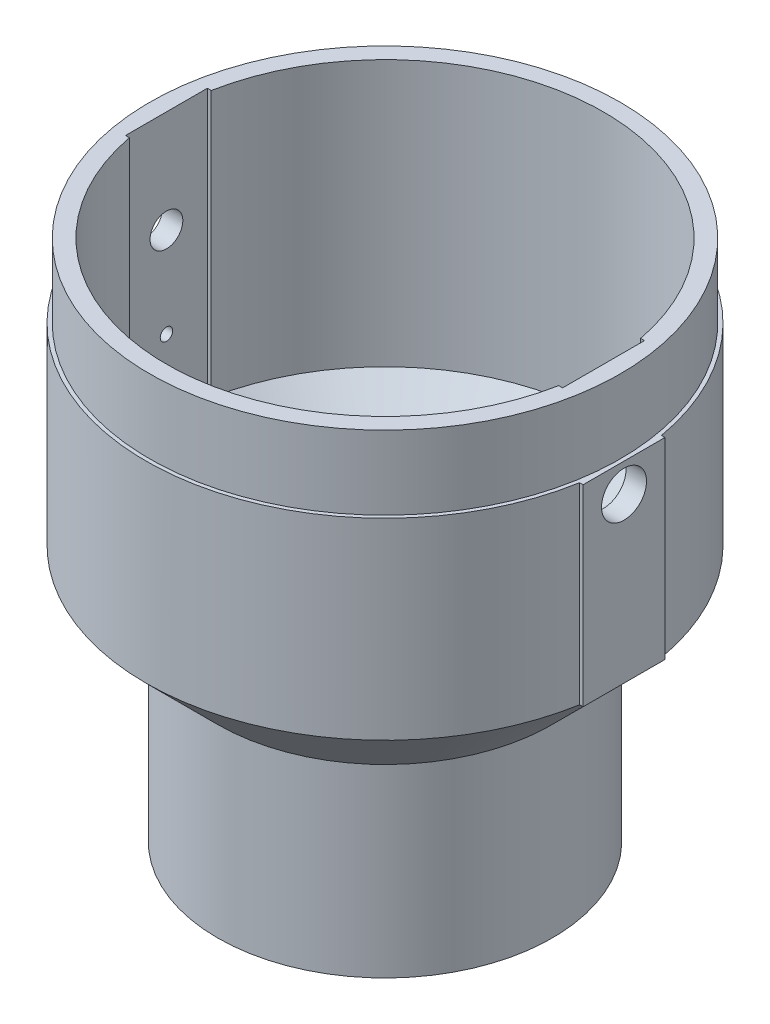
ISO-10303-21;
HEADER;
FILE_DESCRIPTION(('STEP AP214'),'2;1');
FILE_NAME('part.step','',(''),(''),'','','');
FILE_SCHEMA(('AUTOMOTIVE_DESIGN { 1 0 10303 214 1 1 1 1 }'));
ENDSEC;
DATA;
#1=APPLICATION_CONTEXT('core data for automotive mechanical design processes');
#2=APPLICATION_PROTOCOL_DEFINITION('international standard','automotive_design',2000,#1);
#3=PRODUCT_CONTEXT('',#1,'mechanical');
#4=PRODUCT('Part','Part','',(#3));
#5=PRODUCT_RELATED_PRODUCT_CATEGORY('part','',(#4));
#6=PRODUCT_DEFINITION_FORMATION('','',#4);
#7=PRODUCT_DEFINITION_CONTEXT('part definition',#1,'design');
#8=PRODUCT_DEFINITION('design','',#6,#7);
#9=PRODUCT_DEFINITION_SHAPE('','',#8);
#10=(LENGTH_UNIT() NAMED_UNIT(*) SI_UNIT(.MILLI.,.METRE.));
#11=(NAMED_UNIT(*) PLANE_ANGLE_UNIT() SI_UNIT($,.RADIAN.));
#12=(NAMED_UNIT(*) SI_UNIT($,.STERADIAN.) SOLID_ANGLE_UNIT());
#13=UNCERTAINTY_MEASURE_WITH_UNIT(LENGTH_MEASURE(1.E-05),#10,'distance_accuracy_value','');
#14=(GEOMETRIC_REPRESENTATION_CONTEXT(3) GLOBAL_UNCERTAINTY_ASSIGNED_CONTEXT((#13)) GLOBAL_UNIT_ASSIGNED_CONTEXT((#10,
#11,#12)) REPRESENTATION_CONTEXT('',''));
#15=CARTESIAN_POINT('',(0.,0.,0.));
#16=DIRECTION('',(0.,0.,1.));
#17=DIRECTION('',(1.,0.,0.));
#18=AXIS2_PLACEMENT_3D('',#15,#16,#17);
#19=CARTESIAN_POINT('',(0.,0.,0.));
#20=DIRECTION('',(0.,1.,0.));
#21=DIRECTION('',(0.,0.,1.));
#22=AXIS2_PLACEMENT_3D('',#19,#20,#21);
#23=CYLINDRICAL_SURFACE('',#22,53.41);
#24=DIRECTION('',(0.,1.,0.));
#25=VECTOR('',#24,1.);
#26=CARTESIAN_POINT('',(52.4654943748746,0.,-10.));
#27=LINE('',#26,#25);
#28=CARTESIAN_POINT('',(52.4654943748746,-65.,-10.));
#29=VERTEX_POINT('',#28);
#30=CARTESIAN_POINT('',(52.4654943748746,0.,-10.));
#31=VERTEX_POINT('',#30);
#32=EDGE_CURVE('E195',#29,#31,#27,.T.);
#33=ORIENTED_EDGE('',*,*,#32,.T.);
#34=CARTESIAN_POINT('',(0.,0.,0.));
#35=DIRECTION('',(0.,1.,0.));
#36=DIRECTION('',(0.,0.,1.));
#37=AXIS2_PLACEMENT_3D('',#34,#35,#36);
#38=CIRCLE('',#37,53.41);
#39=CARTESIAN_POINT('',(-52.4654943748746,0.,-10.));
#40=VERTEX_POINT('',#39);
#41=EDGE_CURVE('E200',#31,#40,#38,.T.);
#42=ORIENTED_EDGE('',*,*,#41,.T.);
#43=DIRECTION('',(0.,1.,0.));
#44=VECTOR('',#43,1.);
#45=CARTESIAN_POINT('',(-52.4654943748746,0.,-10.));
#46=LINE('',#45,#44);
#47=CARTESIAN_POINT('',(-52.4654943748746,-65.,-10.));
#48=VERTEX_POINT('',#47);
#49=EDGE_CURVE('E299',#40,#48,#46,.F.);
#50=ORIENTED_EDGE('',*,*,#49,.T.);
#51=CARTESIAN_POINT('',(0.,-65.,0.));
#52=DIRECTION('',(0.,1.,0.));
#53=DIRECTION('',(0.,0.,1.));
#54=AXIS2_PLACEMENT_3D('',#51,#52,#53);
#55=CIRCLE('',#54,53.41);
#56=EDGE_CURVE('E374',#29,#48,#55,.T.);
#57=ORIENTED_EDGE('',*,*,#56,.F.);
#58=EDGE_LOOP('',(#33,#42,#50,#57));
#59=FACE_BOUND('',#58,.T.);
#60=ADVANCED_FACE('F45',(#59),#23,.F.);
#61=DIRECTION('',(0.,1.,0.));
#62=VECTOR('',#61,1.);
#63=CARTESIAN_POINT('',(52.4654943748746,0.,10.));
#64=LINE('',#63,#62);
#65=CARTESIAN_POINT('',(52.4654943748746,0.,10.));
#66=VERTEX_POINT('',#65);
#67=CARTESIAN_POINT('',(52.4654943748746,-65.,10.));
#68=VERTEX_POINT('',#67);
#69=EDGE_CURVE('E215',#66,#68,#64,.F.);
#70=ORIENTED_EDGE('',*,*,#69,.T.);
#71=CARTESIAN_POINT('',(-52.4654943748746,-65.,10.));
#72=VERTEX_POINT('',#71);
#73=EDGE_CURVE('E380',#72,#68,#55,.T.);
#74=ORIENTED_EDGE('',*,*,#73,.F.);
#75=DIRECTION('',(0.,1.,0.));
#76=VECTOR('',#75,1.);
#77=CARTESIAN_POINT('',(-52.4654943748746,0.,10.));
#78=LINE('',#77,#76);
#79=CARTESIAN_POINT('',(-52.4654943748746,0.,10.));
#80=VERTEX_POINT('',#79);
#81=EDGE_CURVE('E279',#72,#80,#78,.T.);
#82=ORIENTED_EDGE('',*,*,#81,.T.);
#83=EDGE_CURVE('E370',#80,#66,#38,.T.);
#84=ORIENTED_EDGE('',*,*,#83,.T.);
#85=EDGE_LOOP('',(#70,#74,#82,#84));
#86=FACE_BOUND('',#85,.T.);
#87=ADVANCED_FACE('F456',(#86),#23,.F.);
#88=CARTESIAN_POINT('',(0.,0.,0.));
#89=DIRECTION('',(0.,1.,0.));
#90=DIRECTION('',(0.,0.,1.));
#91=AXIS2_PLACEMENT_3D('',#88,#89,#90);
#92=CYLINDRICAL_SURFACE('',#91,58.41);
#93=CARTESIAN_POINT('',(0.,-18.,0.));
#94=DIRECTION('',(0.,-1.,0.));
#95=DIRECTION('',(0.,0.,-1.));
#96=AXIS2_PLACEMENT_3D('',#93,#94,#95);
#97=CIRCLE('',#96,58.41);
#98=CARTESIAN_POINT('',(-57.547615936718,-18.,-10.));
#99=VERTEX_POINT('',#98);
#100=CARTESIAN_POINT('',(57.547615936718,-18.,-10.));
#101=VERTEX_POINT('',#100);
#102=EDGE_CURVE('E359',#99,#101,#97,.T.);
#103=ORIENTED_EDGE('',*,*,#102,.T.);
#104=DIRECTION('',(0.,1.,0.));
#105=VECTOR('',#104,1.);
#106=CARTESIAN_POINT('',(57.547615936718,0.,-10.));
#107=LINE('',#106,#105);
#108=CARTESIAN_POINT('',(57.547615936718,-65.,-10.));
#109=VERTEX_POINT('',#108);
#110=EDGE_CURVE('E70',#109,#101,#107,.T.);
#111=ORIENTED_EDGE('',*,*,#110,.F.);
#112=CARTESIAN_POINT('',(0.,-65.,0.));
#113=DIRECTION('',(0.,1.,0.));
#114=DIRECTION('',(0.,0.,1.));
#115=AXIS2_PLACEMENT_3D('',#112,#113,#114);
#116=CIRCLE('',#115,58.41);
#117=CARTESIAN_POINT('',(-57.547615936718,-65.,-10.));
#118=VERTEX_POINT('',#117);
#119=EDGE_CURVE('E55',#109,#118,#116,.T.);
#120=ORIENTED_EDGE('',*,*,#119,.T.);
#121=DIRECTION('',(0.,1.,0.));
#122=VECTOR('',#121,1.);
#123=CARTESIAN_POINT('',(-57.547615936718,0.,-10.));
#124=LINE('',#123,#122);
#125=EDGE_CURVE('E337',#99,#118,#124,.F.);
#126=ORIENTED_EDGE('',*,*,#125,.F.);
#127=EDGE_LOOP('',(#103,#111,#120,#126));
#128=FACE_BOUND('',#127,.T.);
#129=ADVANCED_FACE('F429',(#128),#92,.T.);
#130=CARTESIAN_POINT('',(-57.547615936718,-65.,10.));
#131=VERTEX_POINT('',#130);
#132=CARTESIAN_POINT('',(57.547615936718,-65.,10.));
#133=VERTEX_POINT('',#132);
#134=EDGE_CURVE('E54',#131,#133,#116,.T.);
#135=ORIENTED_EDGE('',*,*,#134,.T.);
#136=DIRECTION('',(0.,1.,0.));
#137=VECTOR('',#136,1.);
#138=CARTESIAN_POINT('',(57.547615936718,0.,10.));
#139=LINE('',#138,#137);
#140=CARTESIAN_POINT('',(57.547615936718,-18.,10.));
#141=VERTEX_POINT('',#140);
#142=EDGE_CURVE('E246',#141,#133,#139,.F.);
#143=ORIENTED_EDGE('',*,*,#142,.F.);
#144=CARTESIAN_POINT('',(-57.547615936718,-18.,10.));
#145=VERTEX_POINT('',#144);
#146=EDGE_CURVE('E341',#141,#145,#97,.T.);
#147=ORIENTED_EDGE('',*,*,#146,.T.);
#148=DIRECTION('',(0.,1.,0.));
#149=VECTOR('',#148,1.);
#150=CARTESIAN_POINT('',(-57.547615936718,0.,10.));
#151=LINE('',#150,#149);
#152=EDGE_CURVE('E322',#131,#145,#151,.T.);
#153=ORIENTED_EDGE('',*,*,#152,.F.);
#154=EDGE_LOOP('',(#135,#143,#147,#153));
#155=FACE_BOUND('',#154,.T.);
#156=ADVANCED_FACE('F405',(#155),#92,.T.);
#157=CARTESIAN_POINT('',(53.41,0.,0.));
#158=DIRECTION('',(0.,-1.,0.));
#159=DIRECTION('',(0.,0.,-1.));
#160=AXIS2_PLACEMENT_3D('',#157,#158,#159);
#161=PLANE('',#160);
#162=DIRECTION('',(1.,0.,0.));
#163=VECTOR('',#162,1.);
#164=CARTESIAN_POINT('',(-58.411,0.,-10.));
#165=LINE('',#164,#163);
#166=CARTESIAN_POINT('',(53.41,0.,-10.));
#167=VERTEX_POINT('',#166);
#168=EDGE_CURVE('E190',#31,#167,#165,.T.);
#169=ORIENTED_EDGE('',*,*,#168,.T.);
#170=DIRECTION('',(0.,0.,-1.));
#171=VECTOR('',#170,1.);
#172=CARTESIAN_POINT('',(53.41,0.,10.));
#173=LINE('',#172,#171);
#174=CARTESIAN_POINT('',(53.41,0.,10.));
#175=VERTEX_POINT('',#174);
#176=EDGE_CURVE('E173',#175,#167,#173,.T.);
#177=ORIENTED_EDGE('',*,*,#176,.F.);
#178=DIRECTION('',(1.,0.,0.));
#179=VECTOR('',#178,1.);
#180=CARTESIAN_POINT('',(-58.411,0.,10.));
#181=LINE('',#180,#179);
#182=EDGE_CURVE('E184',#66,#175,#181,.T.);
#183=ORIENTED_EDGE('',*,*,#182,.F.);
#184=ORIENTED_EDGE('',*,*,#83,.F.);
#185=DIRECTION('',(-1.,0.,0.));
#186=VECTOR('',#185,1.);
#187=CARTESIAN_POINT('',(58.411,0.,10.));
#188=LINE('',#187,#186);
#189=CARTESIAN_POINT('',(-53.41,0.,10.));
#190=VERTEX_POINT('',#189);
#191=EDGE_CURVE('E280',#80,#190,#188,.T.);
#192=ORIENTED_EDGE('',*,*,#191,.T.);
#193=DIRECTION('',(0.,0.,1.));
#194=VECTOR('',#193,1.);
#195=CARTESIAN_POINT('',(-53.41,0.,-10.));
#196=LINE('',#195,#194);
#197=CARTESIAN_POINT('',(-53.41,0.,-10.));
#198=VERTEX_POINT('',#197);
#199=EDGE_CURVE('E304',#198,#190,#196,.T.);
#200=ORIENTED_EDGE('',*,*,#199,.F.);
#201=DIRECTION('',(-1.,0.,0.));
#202=VECTOR('',#201,1.);
#203=CARTESIAN_POINT('',(58.411,0.,-10.));
#204=LINE('',#203,#202);
#205=EDGE_CURVE('E303',#40,#198,#204,.T.);
#206=ORIENTED_EDGE('',*,*,#205,.F.);
#207=ORIENTED_EDGE('',*,*,#41,.F.);
#208=EDGE_LOOP('',(#169,#177,#183,#184,#192,#200,#206,#207));
#209=FACE_BOUND('',#208,.T.);
#210=CARTESIAN_POINT('',(0.,0.,0.));
#211=DIRECTION('',(0.,-1.,0.));
#212=DIRECTION('',(0.,0.,-1.));
#213=AXIS2_PLACEMENT_3D('',#210,#211,#212);
#214=CIRCLE('',#213,57.5);
#215=CARTESIAN_POINT('',(0.,0.,-57.5));
#216=VERTEX_POINT('',#215);
#217=EDGE_CURVE('E366',#216,#216,#214,.T.);
#218=ORIENTED_EDGE('',*,*,#217,.F.);
#219=EDGE_LOOP('',(#218));
#220=FACE_BOUND('',#219,.T.);
#221=ADVANCED_FACE('F47',(#209,#220),#161,.F.);
#222=CARTESIAN_POINT('',(0.,-82.4999999999999,0.));
#223=DIRECTION('',(0.,1.,0.));
#224=DIRECTION('',(0.,0.,1.));
#225=AXIS2_PLACEMENT_3D('',#222,#223,#224);
#226=CONICAL_SURFACE('',#225,40.91,0.785398163397452);
#227=CARTESIAN_POINT('',(-58.41,-65.,0.));
#228=VERTEX_POINT('',#227);
#229=EDGE_CURVE('E11',#118,#228,#116,.T.);
#230=ORIENTED_EDGE('',*,*,#229,.F.);
#231=ORIENTED_EDGE('',*,*,#119,.F.);
#232=CARTESIAN_POINT('',(0.,-65.,0.));
#233=DIRECTION('',(0.,-1.,0.));
#234=DIRECTION('',(0.,0.,-1.));
#235=AXIS2_PLACEMENT_3D('',#232,#233,#234);
#236=CIRCLE('',#235,58.41);
#237=CARTESIAN_POINT('',(58.41,-65.,0.));
#238=VERTEX_POINT('',#237);
#239=EDGE_CURVE('E228',#238,#109,#236,.F.);
#240=ORIENTED_EDGE('',*,*,#239,.F.);
#241=CARTESIAN_POINT('',(0.,-65.,0.));
#242=DIRECTION('',(0.,-1.,0.));
#243=DIRECTION('',(0.,0.,-1.));
#244=AXIS2_PLACEMENT_3D('',#241,#242,#243);
#245=CIRCLE('',#244,58.41);
#246=EDGE_CURVE('E250',#133,#238,#245,.F.);
#247=ORIENTED_EDGE('',*,*,#246,.F.);
#248=ORIENTED_EDGE('',*,*,#134,.F.);
#249=CARTESIAN_POINT('',(0.,-65.,0.));
#250=DIRECTION('',(0.,-1.,0.));
#251=DIRECTION('',(0.,0.,-1.));
#252=AXIS2_PLACEMENT_3D('',#249,#250,#251);
#253=CIRCLE('',#252,58.41);
#254=EDGE_CURVE('E318',#228,#131,#253,.F.);
#255=ORIENTED_EDGE('',*,*,#254,.F.);
#256=EDGE_LOOP('',(#230,#231,#240,#247,#248,#255));
#257=FACE_BOUND('',#256,.T.);
#258=CARTESIAN_POINT('',(0.,-82.4999999999999,0.));
#259=DIRECTION('',(0.,1.,0.));
#260=DIRECTION('',(0.,0.,1.));
#261=AXIS2_PLACEMENT_3D('',#258,#259,#260);
#262=CIRCLE('',#261,40.91);
#263=CARTESIAN_POINT('',(0.,-82.4999999999999,40.91));
#264=VERTEX_POINT('',#263);
#265=EDGE_CURVE('E391',#264,#264,#262,.T.);
#266=ORIENTED_EDGE('',*,*,#265,.T.);
#267=EDGE_LOOP('',(#266));
#268=FACE_BOUND('',#267,.T.);
#269=ADVANCED_FACE('F443',(#257,#268),#226,.T.);
#270=CARTESIAN_POINT('',(0.,0.,0.));
#271=DIRECTION('',(0.,1.,0.));
#272=DIRECTION('',(0.,0.,1.));
#273=AXIS2_PLACEMENT_3D('',#270,#271,#272);
#274=CYLINDRICAL_SURFACE('',#273,40.91);
#275=ORIENTED_EDGE('',*,*,#265,.F.);
#276=EDGE_LOOP('',(#275));
#277=FACE_BOUND('',#276,.T.);
#278=CARTESIAN_POINT('',(0.,-127.679491924311,0.));
#279=DIRECTION('',(0.,1.,0.));
#280=DIRECTION('',(0.,0.,1.));
#281=AXIS2_PLACEMENT_3D('',#278,#279,#280);
#282=CIRCLE('',#281,40.91);
#283=CARTESIAN_POINT('',(0.,-127.679491924311,40.91));
#284=VERTEX_POINT('',#283);
#285=EDGE_CURVE('E388',#284,#284,#282,.T.);
#286=ORIENTED_EDGE('',*,*,#285,.T.);
#287=EDGE_LOOP('',(#286));
#288=FACE_BOUND('',#287,.T.);
#289=ADVANCED_FACE('F478',(#277,#288),#274,.T.);
#290=CARTESIAN_POINT('',(35.91,-127.679491924311,0.));
#291=DIRECTION('',(0.,1.,0.));
#292=DIRECTION('',(0.,0.,1.));
#293=AXIS2_PLACEMENT_3D('',#290,#291,#292);
#294=PLANE('',#293);
#295=ORIENTED_EDGE('',*,*,#285,.F.);
#296=EDGE_LOOP('',(#295));
#297=FACE_BOUND('',#296,.T.);
#298=CARTESIAN_POINT('',(0.,-127.679491924311,0.));
#299=DIRECTION('',(0.,1.,0.));
#300=DIRECTION('',(0.,0.,1.));
#301=AXIS2_PLACEMENT_3D('',#298,#299,#300);
#302=CIRCLE('',#301,35.91);
#303=CARTESIAN_POINT('',(0.,-127.679491924311,35.91));
#304=VERTEX_POINT('',#303);
#305=EDGE_CURVE('E384',#304,#304,#302,.T.);
#306=ORIENTED_EDGE('',*,*,#305,.T.);
#307=EDGE_LOOP('',(#306));
#308=FACE_BOUND('',#307,.T.);
#309=ADVANCED_FACE('F474',(#297,#308),#294,.F.);
#310=CARTESIAN_POINT('',(0.,0.,0.));
#311=DIRECTION('',(0.,1.,0.));
#312=DIRECTION('',(0.,0.,1.));
#313=AXIS2_PLACEMENT_3D('',#310,#311,#312);
#314=CYLINDRICAL_SURFACE('',#313,35.91);
#315=ORIENTED_EDGE('',*,*,#305,.F.);
#316=EDGE_LOOP('',(#315));
#317=FACE_BOUND('',#316,.T.);
#318=CARTESIAN_POINT('',(0.,-82.4999999999999,0.));
#319=DIRECTION('',(0.,1.,0.));
#320=DIRECTION('',(0.,0.,1.));
#321=AXIS2_PLACEMENT_3D('',#318,#319,#320);
#322=CIRCLE('',#321,35.91);
#323=CARTESIAN_POINT('',(0.,-82.4999999999999,35.91));
#324=VERTEX_POINT('',#323);
#325=EDGE_CURVE('E379',#324,#324,#322,.T.);
#326=ORIENTED_EDGE('',*,*,#325,.T.);
#327=EDGE_LOOP('',(#326));
#328=FACE_BOUND('',#327,.T.);
#329=ADVANCED_FACE('F470',(#317,#328),#314,.F.);
#330=CARTESIAN_POINT('',(0.,-65.,0.));
#331=DIRECTION('',(0.,1.,0.));
#332=DIRECTION('',(0.,0.,1.));
#333=AXIS2_PLACEMENT_3D('',#330,#331,#332);
#334=CONICAL_SURFACE('',#333,53.41,0.785398163397451);
#335=ORIENTED_EDGE('',*,*,#325,.F.);
#336=EDGE_LOOP('',(#335));
#337=FACE_BOUND('',#336,.T.);
#338=CARTESIAN_POINT('',(-53.41,-65.,0.));
#339=VERTEX_POINT('',#338);
#340=EDGE_CURVE('E375',#48,#339,#55,.T.);
#341=ORIENTED_EDGE('',*,*,#340,.T.);
#342=CARTESIAN_POINT('',(0.,-65.,0.));
#343=DIRECTION('',(0.,1.,0.));
#344=DIRECTION('',(0.,0.,1.));
#345=AXIS2_PLACEMENT_3D('',#342,#343,#344);
#346=CIRCLE('',#345,53.41);
#347=EDGE_CURVE('E271',#339,#72,#346,.T.);
#348=ORIENTED_EDGE('',*,*,#347,.T.);
#349=ORIENTED_EDGE('',*,*,#73,.T.);
#350=CARTESIAN_POINT('',(0.,-65.,0.));
#351=DIRECTION('',(0.,1.,0.));
#352=DIRECTION('',(0.,0.,1.));
#353=AXIS2_PLACEMENT_3D('',#350,#351,#352);
#354=CIRCLE('',#353,53.41);
#355=CARTESIAN_POINT('',(53.41,-65.,0.));
#356=VERTEX_POINT('',#355);
#357=EDGE_CURVE('E202',#68,#356,#354,.T.);
#358=ORIENTED_EDGE('',*,*,#357,.T.);
#359=CARTESIAN_POINT('',(0.,-65.,0.));
#360=DIRECTION('',(0.,1.,0.));
#361=DIRECTION('',(0.,0.,1.));
#362=AXIS2_PLACEMENT_3D('',#359,#360,#361);
#363=CIRCLE('',#362,53.41);
#364=EDGE_CURVE('E62',#356,#29,#363,.T.);
#365=ORIENTED_EDGE('',*,*,#364,.T.);
#366=ORIENTED_EDGE('',*,*,#56,.T.);
#367=EDGE_LOOP('',(#341,#348,#349,#358,#365,#366));
#368=FACE_BOUND('',#367,.T.);
#369=ADVANCED_FACE('F467',(#337,#368),#334,.F.);
#370=CARTESIAN_POINT('',(0.,-65.,0.));
#371=DIRECTION('',(0.,-1.,0.));
#372=DIRECTION('',(0.,0.,-1.));
#373=AXIS2_PLACEMENT_3D('',#370,#371,#372);
#374=CYLINDRICAL_SURFACE('',#373,57.5);
#375=ORIENTED_EDGE('',*,*,#217,.T.);
#376=EDGE_LOOP('',(#375));
#377=FACE_BOUND('',#376,.T.);
#378=CARTESIAN_POINT('',(0.,-18.,0.));
#379=DIRECTION('',(0.,-1.,0.));
#380=DIRECTION('',(0.,0.,-1.));
#381=AXIS2_PLACEMENT_3D('',#378,#379,#380);
#382=CIRCLE('',#381,57.5);
#383=CARTESIAN_POINT('',(0.,-18.,-57.5));
#384=VERTEX_POINT('',#383);
#385=EDGE_CURVE('E362',#384,#384,#382,.T.);
#386=ORIENTED_EDGE('',*,*,#385,.F.);
#387=EDGE_LOOP('',(#386));
#388=FACE_BOUND('',#387,.T.);
#389=ADVANCED_FACE('F465',(#377,#388),#374,.T.);
#390=CARTESIAN_POINT('',(-57.5,-18.,0.));
#391=DIRECTION('',(0.,1.,0.));
#392=DIRECTION('',(0.,0.,1.));
#393=AXIS2_PLACEMENT_3D('',#390,#391,#392);
#394=PLANE('',#393);
#395=ORIENTED_EDGE('',*,*,#385,.T.);
#396=EDGE_LOOP('',(#395));
#397=FACE_BOUND('',#396,.T.);
#398=ORIENTED_EDGE('',*,*,#102,.F.);
#399=DIRECTION('',(-1.,0.,0.));
#400=VECTOR('',#399,1.);
#401=CARTESIAN_POINT('',(58.411,-18.,-10.));
#402=LINE('',#401,#400);
#403=CARTESIAN_POINT('',(-58.41,-18.,-10.));
#404=VERTEX_POINT('',#403);
#405=EDGE_CURVE('E342',#99,#404,#402,.T.);
#406=ORIENTED_EDGE('',*,*,#405,.T.);
#407=DIRECTION('',(0.,0.,-1.));
#408=VECTOR('',#407,1.);
#409=CARTESIAN_POINT('',(-58.41,-18.,-10.));
#410=LINE('',#409,#408);
#411=CARTESIAN_POINT('',(-58.41,-18.,10.));
#412=VERTEX_POINT('',#411);
#413=EDGE_CURVE('E350',#412,#404,#410,.T.);
#414=ORIENTED_EDGE('',*,*,#413,.F.);
#415=DIRECTION('',(-1.,0.,0.));
#416=VECTOR('',#415,1.);
#417=CARTESIAN_POINT('',(58.411,-18.,10.));
#418=LINE('',#417,#416);
#419=EDGE_CURVE('E326',#145,#412,#418,.T.);
#420=ORIENTED_EDGE('',*,*,#419,.F.);
#421=ORIENTED_EDGE('',*,*,#146,.F.);
#422=DIRECTION('',(1.,0.,0.));
#423=VECTOR('',#422,1.);
#424=CARTESIAN_POINT('',(-58.411,-18.,10.));
#425=LINE('',#424,#423);
#426=CARTESIAN_POINT('',(58.41,-18.,10.));
#427=VERTEX_POINT('',#426);
#428=EDGE_CURVE('E251',#141,#427,#425,.T.);
#429=ORIENTED_EDGE('',*,*,#428,.T.);
#430=DIRECTION('',(0.,0.,1.));
#431=VECTOR('',#430,1.);
#432=CARTESIAN_POINT('',(58.41,-18.,10.));
#433=LINE('',#432,#431);
#434=CARTESIAN_POINT('',(58.41,-18.,-10.));
#435=VERTEX_POINT('',#434);
#436=EDGE_CURVE('E258',#435,#427,#433,.T.);
#437=ORIENTED_EDGE('',*,*,#436,.F.);
#438=DIRECTION('',(1.,0.,0.));
#439=VECTOR('',#438,1.);
#440=CARTESIAN_POINT('',(-58.411,-18.,-10.));
#441=LINE('',#440,#439);
#442=EDGE_CURVE('E231',#101,#435,#441,.T.);
#443=ORIENTED_EDGE('',*,*,#442,.F.);
#444=EDGE_LOOP('',(#398,#406,#414,#420,#421,#429,#437,#443));
#445=FACE_BOUND('',#444,.T.);
#446=ADVANCED_FACE('F418',(#397,#445),#394,.T.);
#447=CARTESIAN_POINT('',(-58.41,0.,0.));
#448=DIRECTION('',(-1.,0.,0.));
#449=DIRECTION('',(0.,0.,1.));
#450=AXIS2_PLACEMENT_3D('',#447,#448,#449);
#451=PLANE('',#450);
#452=CARTESIAN_POINT('',(-58.41,-25.,0.));
#453=DIRECTION('',(-1.,0.,0.));
#454=DIRECTION('',(0.,0.,1.));
#455=AXIS2_PLACEMENT_3D('',#452,#453,#454);
#456=CIRCLE('',#455,4.);
#457=CARTESIAN_POINT('',(-58.41,-25.,4.));
#458=VERTEX_POINT('',#457);
#459=EDGE_CURVE('E876',#458,#458,#456,.T.);
#460=ORIENTED_EDGE('',*,*,#459,.F.);
#461=EDGE_LOOP('',(#460));
#462=FACE_BOUND('',#461,.T.);
#463=CARTESIAN_POINT('',(-58.41,-47.0538,0.));
#464=DIRECTION('',(-1.,0.,0.));
#465=DIRECTION('',(0.,0.,1.));
#466=AXIS2_PLACEMENT_3D('',#463,#464,#465);
#467=CIRCLE('',#466,1.515);
#468=CARTESIAN_POINT('',(-58.41,-47.0538,1.515));
#469=VERTEX_POINT('',#468);
#470=EDGE_CURVE('E915',#469,#469,#467,.T.);
#471=ORIENTED_EDGE('',*,*,#470,.F.);
#472=EDGE_LOOP('',(#471));
#473=FACE_BOUND('',#472,.T.);
#474=CARTESIAN_POINT('',(-58.41,-57.0538,0.));
#475=DIRECTION('',(-1.,0.,0.));
#476=DIRECTION('',(0.,0.,1.));
#477=AXIS2_PLACEMENT_3D('',#474,#475,#476);
#478=CIRCLE('',#477,1.51499999999999);
#479=CARTESIAN_POINT('',(-58.41,-57.0538,1.51499999999999));
#480=VERTEX_POINT('',#479);
#481=EDGE_CURVE('E879',#480,#480,#478,.T.);
#482=ORIENTED_EDGE('',*,*,#481,.F.);
#483=EDGE_LOOP('',(#482));
#484=FACE_BOUND('',#483,.T.);
#485=DIRECTION('',(0.,0.,1.));
#486=VECTOR('',#485,1.);
#487=CARTESIAN_POINT('',(-58.41,-65.,-10.));
#488=LINE('',#487,#486);
#489=CARTESIAN_POINT('',(-58.41,-65.,-10.));
#490=VERTEX_POINT('',#489);
#491=EDGE_CURVE('E346',#490,#228,#488,.T.);
#492=ORIENTED_EDGE('',*,*,#491,.T.);
#493=DIRECTION('',(0.,0.,1.));
#494=VECTOR('',#493,1.);
#495=CARTESIAN_POINT('',(-58.41,-65.,-10.));
#496=LINE('',#495,#494);
#497=CARTESIAN_POINT('',(-58.41,-65.,10.));
#498=VERTEX_POINT('',#497);
#499=EDGE_CURVE('E297',#228,#498,#496,.T.);
#500=ORIENTED_EDGE('',*,*,#499,.T.);
#501=DIRECTION('',(0.,1.,0.));
#502=VECTOR('',#501,1.);
#503=CARTESIAN_POINT('',(-58.41,-18.,10.));
#504=LINE('',#503,#502);
#505=EDGE_CURVE('E314',#498,#412,#504,.T.);
#506=ORIENTED_EDGE('',*,*,#505,.T.);
#507=ORIENTED_EDGE('',*,*,#413,.T.);
#508=DIRECTION('',(0.,-1.,0.));
#509=VECTOR('',#508,1.);
#510=CARTESIAN_POINT('',(-58.41,-18.,-10.));
#511=LINE('',#510,#509);
#512=EDGE_CURVE('E331',#404,#490,#511,.T.);
#513=ORIENTED_EDGE('',*,*,#512,.T.);
#514=EDGE_LOOP('',(#492,#500,#506,#507,#513));
#515=FACE_BOUND('',#514,.T.);
#516=ADVANCED_FACE('F436',(#462,#473,#484,#515),#451,.T.);
#517=CARTESIAN_POINT('',(58.411,-65.,-10.));
#518=DIRECTION('',(0.,-1.,0.));
#519=DIRECTION('',(0.,0.,-1.));
#520=AXIS2_PLACEMENT_3D('',#517,#518,#519);
#521=PLANE('',#520);
#522=DIRECTION('',(-1.,0.,0.));
#523=VECTOR('',#522,1.);
#524=CARTESIAN_POINT('',(58.411,-65.,-10.));
#525=LINE('',#524,#523);
#526=EDGE_CURVE('E354',#118,#490,#525,.T.);
#527=ORIENTED_EDGE('',*,*,#526,.F.);
#528=ORIENTED_EDGE('',*,*,#229,.T.);
#529=ORIENTED_EDGE('',*,*,#491,.F.);
#530=EDGE_LOOP('',(#527,#528,#529));
#531=FACE_BOUND('',#530,.T.);
#532=ADVANCED_FACE('F445',(#531),#521,.T.);
#533=CARTESIAN_POINT('',(58.411,-18.,-10.));
#534=DIRECTION('',(0.,0.,-1.));
#535=DIRECTION('',(0.,1.,0.));
#536=AXIS2_PLACEMENT_3D('',#533,#534,#535);
#537=PLANE('',#536);
#538=ORIENTED_EDGE('',*,*,#405,.F.);
#539=ORIENTED_EDGE('',*,*,#125,.T.);
#540=ORIENTED_EDGE('',*,*,#526,.T.);
#541=ORIENTED_EDGE('',*,*,#512,.F.);
#542=EDGE_LOOP('',(#538,#539,#540,#541));
#543=FACE_BOUND('',#542,.T.);
#544=ADVANCED_FACE('F432',(#543),#537,.T.);
#545=CARTESIAN_POINT('',(58.411,-65.,-10.));
#546=DIRECTION('',(0.,-1.,0.));
#547=DIRECTION('',(0.,0.,-1.));
#548=AXIS2_PLACEMENT_3D('',#545,#546,#547);
#549=PLANE('',#548);
#550=ORIENTED_EDGE('',*,*,#499,.F.);
#551=ORIENTED_EDGE('',*,*,#254,.T.);
#552=DIRECTION('',(-1.,0.,0.));
#553=VECTOR('',#552,1.);
#554=CARTESIAN_POINT('',(58.411,-65.,10.));
#555=LINE('',#554,#553);
#556=EDGE_CURVE('E327',#131,#498,#555,.T.);
#557=ORIENTED_EDGE('',*,*,#556,.T.);
#558=EDGE_LOOP('',(#550,#551,#557));
#559=FACE_BOUND('',#558,.T.);
#560=ADVANCED_FACE('F442',(#559),#549,.T.);
#561=CARTESIAN_POINT('',(58.411,-18.,10.));
#562=DIRECTION('',(0.,0.,1.));
#563=DIRECTION('',(0.,-1.,0.));
#564=AXIS2_PLACEMENT_3D('',#561,#562,#563);
#565=PLANE('',#564);
#566=ORIENTED_EDGE('',*,*,#556,.F.);
#567=ORIENTED_EDGE('',*,*,#152,.T.);
#568=ORIENTED_EDGE('',*,*,#419,.T.);
#569=ORIENTED_EDGE('',*,*,#505,.F.);
#570=EDGE_LOOP('',(#566,#567,#568,#569));
#571=FACE_BOUND('',#570,.T.);
#572=ADVANCED_FACE('F439',(#571),#565,.T.);
#573=CARTESIAN_POINT('',(-53.41,0.,0.));
#574=DIRECTION('',(-1.,0.,0.));
#575=DIRECTION('',(0.,0.,1.));
#576=AXIS2_PLACEMENT_3D('',#573,#574,#575);
#577=PLANE('',#576);
#578=CARTESIAN_POINT('',(-53.41,-25.,0.));
#579=DIRECTION('',(-1.,0.,0.));
#580=DIRECTION('',(0.,0.,1.));
#581=AXIS2_PLACEMENT_3D('',#578,#579,#580);
#582=CIRCLE('',#581,4.);
#583=CARTESIAN_POINT('',(-53.41,-25.,4.));
#584=VERTEX_POINT('',#583);
#585=EDGE_CURVE('E869',#584,#584,#582,.F.);
#586=ORIENTED_EDGE('',*,*,#585,.F.);
#587=EDGE_LOOP('',(#586));
#588=FACE_BOUND('',#587,.T.);
#589=CARTESIAN_POINT('',(-53.41,-47.0538,0.));
#590=DIRECTION('',(-1.,0.,0.));
#591=DIRECTION('',(0.,0.,1.));
#592=AXIS2_PLACEMENT_3D('',#589,#590,#591);
#593=CIRCLE('',#592,1.515);
#594=CARTESIAN_POINT('',(-53.41,-47.0538,1.515));
#595=VERTEX_POINT('',#594);
#596=EDGE_CURVE('E910',#595,#595,#593,.F.);
#597=ORIENTED_EDGE('',*,*,#596,.F.);
#598=EDGE_LOOP('',(#597));
#599=FACE_BOUND('',#598,.T.);
#600=CARTESIAN_POINT('',(-53.41,-57.0538,0.));
#601=DIRECTION('',(-1.,0.,0.));
#602=DIRECTION('',(0.,0.,1.));
#603=AXIS2_PLACEMENT_3D('',#600,#601,#602);
#604=CIRCLE('',#603,1.51499999999999);
#605=CARTESIAN_POINT('',(-53.41,-57.0538,1.51499999999999));
#606=VERTEX_POINT('',#605);
#607=EDGE_CURVE('E911',#606,#606,#604,.F.);
#608=ORIENTED_EDGE('',*,*,#607,.F.);
#609=EDGE_LOOP('',(#608));
#610=FACE_BOUND('',#609,.T.);
#611=DIRECTION('',(0.,0.,-1.));
#612=VECTOR('',#611,1.);
#613=CARTESIAN_POINT('',(-53.41,-65.,-10.));
#614=LINE('',#613,#612);
#615=CARTESIAN_POINT('',(-53.41,-65.,-10.));
#616=VERTEX_POINT('',#615);
#617=EDGE_CURVE('E292',#339,#616,#614,.T.);
#618=ORIENTED_EDGE('',*,*,#617,.T.);
#619=DIRECTION('',(0.,1.,0.));
#620=VECTOR('',#619,1.);
#621=CARTESIAN_POINT('',(-53.41,0.,-10.));
#622=LINE('',#621,#620);
#623=EDGE_CURVE('E293',#616,#198,#622,.T.);
#624=ORIENTED_EDGE('',*,*,#623,.T.);
#625=ORIENTED_EDGE('',*,*,#199,.T.);
#626=DIRECTION('',(0.,-1.,0.));
#627=VECTOR('',#626,1.);
#628=CARTESIAN_POINT('',(-53.41,0.,10.));
#629=LINE('',#628,#627);
#630=CARTESIAN_POINT('',(-53.41,-65.,10.));
#631=VERTEX_POINT('',#630);
#632=EDGE_CURVE('E270',#190,#631,#629,.T.);
#633=ORIENTED_EDGE('',*,*,#632,.T.);
#634=DIRECTION('',(0.,0.,-1.));
#635=VECTOR('',#634,1.);
#636=CARTESIAN_POINT('',(-53.41,-65.,-10.));
#637=LINE('',#636,#635);
#638=EDGE_CURVE('E275',#631,#339,#637,.T.);
#639=ORIENTED_EDGE('',*,*,#638,.T.);
#640=EDGE_LOOP('',(#618,#624,#625,#633,#639));
#641=FACE_BOUND('',#640,.T.);
#642=ADVANCED_FACE('F527',(#588,#599,#610,#641),#577,.F.);
#643=CARTESIAN_POINT('',(58.411,-65.,-10.));
#644=DIRECTION('',(0.,1.,0.));
#645=DIRECTION('',(0.,0.,1.));
#646=AXIS2_PLACEMENT_3D('',#643,#644,#645);
#647=PLANE('',#646);
#648=DIRECTION('',(-1.,0.,0.));
#649=VECTOR('',#648,1.);
#650=CARTESIAN_POINT('',(58.411,-65.,-10.));
#651=LINE('',#650,#649);
#652=EDGE_CURVE('E298',#48,#616,#651,.T.);
#653=ORIENTED_EDGE('',*,*,#652,.T.);
#654=ORIENTED_EDGE('',*,*,#617,.F.);
#655=ORIENTED_EDGE('',*,*,#340,.F.);
#656=EDGE_LOOP('',(#653,#654,#655));
#657=FACE_BOUND('',#656,.T.);
#658=ADVANCED_FACE('F536',(#657),#647,.T.);
#659=CARTESIAN_POINT('',(58.411,0.,-10.));
#660=DIRECTION('',(0.,0.,1.));
#661=DIRECTION('',(0.,-1.,0.));
#662=AXIS2_PLACEMENT_3D('',#659,#660,#661);
#663=PLANE('',#662);
#664=ORIENTED_EDGE('',*,*,#205,.T.);
#665=ORIENTED_EDGE('',*,*,#623,.F.);
#666=ORIENTED_EDGE('',*,*,#652,.F.);
#667=ORIENTED_EDGE('',*,*,#49,.F.);
#668=EDGE_LOOP('',(#664,#665,#666,#667));
#669=FACE_BOUND('',#668,.T.);
#670=ADVANCED_FACE('F524',(#669),#663,.T.);
#671=CARTESIAN_POINT('',(58.411,-65.,-10.));
#672=DIRECTION('',(0.,1.,0.));
#673=DIRECTION('',(0.,0.,1.));
#674=AXIS2_PLACEMENT_3D('',#671,#672,#673);
#675=PLANE('',#674);
#676=ORIENTED_EDGE('',*,*,#638,.F.);
#677=DIRECTION('',(-1.,0.,0.));
#678=VECTOR('',#677,1.);
#679=CARTESIAN_POINT('',(58.411,-65.,10.));
#680=LINE('',#679,#678);
#681=EDGE_CURVE('E276',#72,#631,#680,.T.);
#682=ORIENTED_EDGE('',*,*,#681,.F.);
#683=ORIENTED_EDGE('',*,*,#347,.F.);
#684=EDGE_LOOP('',(#676,#682,#683));
#685=FACE_BOUND('',#684,.T.);
#686=ADVANCED_FACE('F512',(#685),#675,.T.);
#687=CARTESIAN_POINT('',(58.411,0.,10.));
#688=DIRECTION('',(0.,0.,-1.));
#689=DIRECTION('',(0.,1.,0.));
#690=AXIS2_PLACEMENT_3D('',#687,#688,#689);
#691=PLANE('',#690);
#692=ORIENTED_EDGE('',*,*,#681,.T.);
#693=ORIENTED_EDGE('',*,*,#632,.F.);
#694=ORIENTED_EDGE('',*,*,#191,.F.);
#695=ORIENTED_EDGE('',*,*,#81,.F.);
#696=EDGE_LOOP('',(#692,#693,#694,#695));
#697=FACE_BOUND('',#696,.T.);
#698=ADVANCED_FACE('F507',(#697),#691,.T.);
#699=CARTESIAN_POINT('',(58.41,0.,0.));
#700=DIRECTION('',(1.,0.,0.));
#701=DIRECTION('',(0.,0.,-1.));
#702=AXIS2_PLACEMENT_3D('',#699,#700,#701);
#703=PLANE('',#702);
#704=CARTESIAN_POINT('',(58.41,-25.,0.));
#705=DIRECTION('',(1.,0.,0.));
#706=DIRECTION('',(0.,0.,-1.));
#707=AXIS2_PLACEMENT_3D('',#704,#705,#706);
#708=CIRCLE('',#707,5.5);
#709=CARTESIAN_POINT('',(58.41,-25.,-5.5));
#710=VERTEX_POINT('',#709);
#711=EDGE_CURVE('E865',#710,#710,#708,.T.);
#712=ORIENTED_EDGE('',*,*,#711,.F.);
#713=EDGE_LOOP('',(#712));
#714=FACE_BOUND('',#713,.T.);
#715=DIRECTION('',(0.,0.,-1.));
#716=VECTOR('',#715,1.);
#717=CARTESIAN_POINT('',(58.41,-65.,10.));
#718=LINE('',#717,#716);
#719=CARTESIAN_POINT('',(58.41,-65.,10.));
#720=VERTEX_POINT('',#719);
#721=EDGE_CURVE('E255',#720,#238,#718,.T.);
#722=ORIENTED_EDGE('',*,*,#721,.T.);
#723=DIRECTION('',(0.,0.,-1.));
#724=VECTOR('',#723,1.);
#725=CARTESIAN_POINT('',(58.41,-65.,10.));
#726=LINE('',#725,#724);
#727=CARTESIAN_POINT('',(58.41,-65.,-10.));
#728=VERTEX_POINT('',#727);
#729=EDGE_CURVE('E213',#238,#728,#726,.T.);
#730=ORIENTED_EDGE('',*,*,#729,.T.);
#731=DIRECTION('',(0.,1.,0.));
#732=VECTOR('',#731,1.);
#733=CARTESIAN_POINT('',(58.41,-18.,-10.));
#734=LINE('',#733,#732);
#735=EDGE_CURVE('E239',#728,#435,#734,.T.);
#736=ORIENTED_EDGE('',*,*,#735,.T.);
#737=ORIENTED_EDGE('',*,*,#436,.T.);
#738=DIRECTION('',(0.,-1.,0.));
#739=VECTOR('',#738,1.);
#740=CARTESIAN_POINT('',(58.41,-18.,10.));
#741=LINE('',#740,#739);
#742=EDGE_CURVE('E235',#427,#720,#741,.T.);
#743=ORIENTED_EDGE('',*,*,#742,.T.);
#744=EDGE_LOOP('',(#722,#730,#736,#737,#743));
#745=FACE_BOUND('',#744,.T.);
#746=ADVANCED_FACE('F422',(#714,#745),#703,.T.);
#747=CARTESIAN_POINT('',(-58.411,-65.,10.));
#748=DIRECTION('',(0.,-1.,0.));
#749=DIRECTION('',(0.,0.,-1.));
#750=AXIS2_PLACEMENT_3D('',#747,#748,#749);
#751=PLANE('',#750);
#752=DIRECTION('',(1.,0.,0.));
#753=VECTOR('',#752,1.);
#754=CARTESIAN_POINT('',(-58.411,-65.,10.));
#755=LINE('',#754,#753);
#756=EDGE_CURVE('E262',#133,#720,#755,.T.);
#757=ORIENTED_EDGE('',*,*,#756,.F.);
#758=ORIENTED_EDGE('',*,*,#246,.T.);
#759=ORIENTED_EDGE('',*,*,#721,.F.);
#760=EDGE_LOOP('',(#757,#758,#759));
#761=FACE_BOUND('',#760,.T.);
#762=ADVANCED_FACE('F412',(#761),#751,.T.);
#763=CARTESIAN_POINT('',(-58.411,-18.,10.));
#764=DIRECTION('',(0.,0.,1.));
#765=DIRECTION('',(0.,-1.,0.));
#766=AXIS2_PLACEMENT_3D('',#763,#764,#765);
#767=PLANE('',#766);
#768=ORIENTED_EDGE('',*,*,#428,.F.);
#769=ORIENTED_EDGE('',*,*,#142,.T.);
#770=ORIENTED_EDGE('',*,*,#756,.T.);
#771=ORIENTED_EDGE('',*,*,#742,.F.);
#772=EDGE_LOOP('',(#768,#769,#770,#771));
#773=FACE_BOUND('',#772,.T.);
#774=ADVANCED_FACE('F416',(#773),#767,.T.);
#775=CARTESIAN_POINT('',(-58.411,-65.,10.));
#776=DIRECTION('',(0.,-1.,0.));
#777=DIRECTION('',(0.,0.,-1.));
#778=AXIS2_PLACEMENT_3D('',#775,#776,#777);
#779=PLANE('',#778);
#780=ORIENTED_EDGE('',*,*,#729,.F.);
#781=ORIENTED_EDGE('',*,*,#239,.T.);
#782=DIRECTION('',(1.,0.,0.));
#783=VECTOR('',#782,1.);
#784=CARTESIAN_POINT('',(-58.411,-65.,-10.));
#785=LINE('',#784,#783);
#786=EDGE_CURVE('E225',#109,#728,#785,.T.);
#787=ORIENTED_EDGE('',*,*,#786,.T.);
#788=EDGE_LOOP('',(#780,#781,#787));
#789=FACE_BOUND('',#788,.T.);
#790=ADVANCED_FACE('F790',(#789),#779,.T.);
#791=CARTESIAN_POINT('',(-58.411,-18.,-10.));
#792=DIRECTION('',(0.,0.,-1.));
#793=DIRECTION('',(0.,1.,0.));
#794=AXIS2_PLACEMENT_3D('',#791,#792,#793);
#795=PLANE('',#794);
#796=ORIENTED_EDGE('',*,*,#786,.F.);
#797=ORIENTED_EDGE('',*,*,#110,.T.);
#798=ORIENTED_EDGE('',*,*,#442,.T.);
#799=ORIENTED_EDGE('',*,*,#735,.F.);
#800=EDGE_LOOP('',(#796,#797,#798,#799));
#801=FACE_BOUND('',#800,.T.);
#802=ADVANCED_FACE('F427',(#801),#795,.T.);
#803=CARTESIAN_POINT('',(53.41,0.,0.));
#804=DIRECTION('',(1.,0.,0.));
#805=DIRECTION('',(0.,0.,-1.));
#806=AXIS2_PLACEMENT_3D('',#803,#804,#805);
#807=PLANE('',#806);
#808=CARTESIAN_POINT('',(53.41,-25.,0.));
#809=DIRECTION('',(1.,0.,0.));
#810=DIRECTION('',(0.,0.,-1.));
#811=AXIS2_PLACEMENT_3D('',#808,#809,#810);
#812=CIRCLE('',#811,5.5);
#813=CARTESIAN_POINT('',(53.41,-25.,-5.5));
#814=VERTEX_POINT('',#813);
#815=EDGE_CURVE('E868',#814,#814,#812,.F.);
#816=ORIENTED_EDGE('',*,*,#815,.F.);
#817=EDGE_LOOP('',(#816));
#818=FACE_BOUND('',#817,.T.);
#819=DIRECTION('',(0.,0.,1.));
#820=VECTOR('',#819,1.);
#821=CARTESIAN_POINT('',(53.41,-65.,10.));
#822=LINE('',#821,#820);
#823=CARTESIAN_POINT('',(53.41,-65.,10.));
#824=VERTEX_POINT('',#823);
#825=EDGE_CURVE('E185',#356,#824,#822,.T.);
#826=ORIENTED_EDGE('',*,*,#825,.T.);
#827=DIRECTION('',(0.,1.,0.));
#828=VECTOR('',#827,1.);
#829=CARTESIAN_POINT('',(53.41,0.,10.));
#830=LINE('',#829,#828);
#831=EDGE_CURVE('E179',#824,#175,#830,.T.);
#832=ORIENTED_EDGE('',*,*,#831,.T.);
#833=ORIENTED_EDGE('',*,*,#176,.T.);
#834=DIRECTION('',(0.,-1.,0.));
#835=VECTOR('',#834,1.);
#836=CARTESIAN_POINT('',(53.41,0.,-10.));
#837=LINE('',#836,#835);
#838=CARTESIAN_POINT('',(53.41,-65.,-10.));
#839=VERTEX_POINT('',#838);
#840=EDGE_CURVE('E177',#167,#839,#837,.T.);
#841=ORIENTED_EDGE('',*,*,#840,.T.);
#842=DIRECTION('',(0.,0.,1.));
#843=VECTOR('',#842,1.);
#844=CARTESIAN_POINT('',(53.41,-65.,10.));
#845=LINE('',#844,#843);
#846=EDGE_CURVE('E194',#839,#356,#845,.T.);
#847=ORIENTED_EDGE('',*,*,#846,.T.);
#848=EDGE_LOOP('',(#826,#832,#833,#841,#847));
#849=FACE_BOUND('',#848,.T.);
#850=ADVANCED_FACE('F176',(#818,#849),#807,.F.);
#851=CARTESIAN_POINT('',(-58.411,-65.,10.));
#852=DIRECTION('',(0.,1.,0.));
#853=DIRECTION('',(0.,0.,1.));
#854=AXIS2_PLACEMENT_3D('',#851,#852,#853);
#855=PLANE('',#854);
#856=DIRECTION('',(1.,0.,0.));
#857=VECTOR('',#856,1.);
#858=CARTESIAN_POINT('',(-58.411,-65.,10.));
#859=LINE('',#858,#857);
#860=EDGE_CURVE('E214',#68,#824,#859,.T.);
#861=ORIENTED_EDGE('',*,*,#860,.T.);
#862=ORIENTED_EDGE('',*,*,#825,.F.);
#863=ORIENTED_EDGE('',*,*,#357,.F.);
#864=EDGE_LOOP('',(#861,#862,#863));
#865=FACE_BOUND('',#864,.T.);
#866=ADVANCED_FACE('F739',(#865),#855,.T.);
#867=CARTESIAN_POINT('',(-58.411,0.,10.));
#868=DIRECTION('',(0.,0.,-1.));
#869=DIRECTION('',(0.,1.,0.));
#870=AXIS2_PLACEMENT_3D('',#867,#868,#869);
#871=PLANE('',#870);
#872=ORIENTED_EDGE('',*,*,#182,.T.);
#873=ORIENTED_EDGE('',*,*,#831,.F.);
#874=ORIENTED_EDGE('',*,*,#860,.F.);
#875=ORIENTED_EDGE('',*,*,#69,.F.);
#876=EDGE_LOOP('',(#872,#873,#874,#875));
#877=FACE_BOUND('',#876,.T.);
#878=ADVANCED_FACE('F730',(#877),#871,.T.);
#879=CARTESIAN_POINT('',(-58.411,-65.,10.));
#880=DIRECTION('',(0.,1.,0.));
#881=DIRECTION('',(0.,0.,1.));
#882=AXIS2_PLACEMENT_3D('',#879,#880,#881);
#883=PLANE('',#882);
#884=ORIENTED_EDGE('',*,*,#846,.F.);
#885=DIRECTION('',(1.,0.,0.));
#886=VECTOR('',#885,1.);
#887=CARTESIAN_POINT('',(-58.411,-65.,-10.));
#888=LINE('',#887,#886);
#889=EDGE_CURVE('E192',#29,#839,#888,.T.);
#890=ORIENTED_EDGE('',*,*,#889,.F.);
#891=ORIENTED_EDGE('',*,*,#364,.F.);
#892=EDGE_LOOP('',(#884,#890,#891));
#893=FACE_BOUND('',#892,.T.);
#894=ADVANCED_FACE('F721',(#893),#883,.T.);
#895=CARTESIAN_POINT('',(-58.411,0.,-10.));
#896=DIRECTION('',(0.,0.,1.));
#897=DIRECTION('',(0.,-1.,0.));
#898=AXIS2_PLACEMENT_3D('',#895,#896,#897);
#899=PLANE('',#898);
#900=ORIENTED_EDGE('',*,*,#889,.T.);
#901=ORIENTED_EDGE('',*,*,#840,.F.);
#902=ORIENTED_EDGE('',*,*,#168,.F.);
#903=ORIENTED_EDGE('',*,*,#32,.F.);
#904=EDGE_LOOP('',(#900,#901,#902,#903));
#905=FACE_BOUND('',#904,.T.);
#906=ADVANCED_FACE('F188',(#905),#899,.T.);
#907=CARTESIAN_POINT('',(37.853650813896,-25.,0.));
#908=DIRECTION('',(1.,0.,0.));
#909=DIRECTION('',(0.,0.,-1.));
#910=AXIS2_PLACEMENT_3D('',#907,#908,#909);
#911=CYLINDRICAL_SURFACE('',#910,5.5);
#912=ORIENTED_EDGE('',*,*,#815,.T.);
#913=EDGE_LOOP('',(#912));
#914=FACE_BOUND('',#913,.T.);
#915=ORIENTED_EDGE('',*,*,#711,.T.);
#916=EDGE_LOOP('',(#915));
#917=FACE_BOUND('',#916,.T.);
#918=ADVANCED_FACE('F662',(#914,#917),#911,.F.);
#919=CARTESIAN_POINT('',(-42.0962915010152,-57.0538,0.));
#920=DIRECTION('',(-1.,0.,0.));
#921=DIRECTION('',(0.,0.,1.));
#922=AXIS2_PLACEMENT_3D('',#919,#920,#921);
#923=CYLINDRICAL_SURFACE('',#922,1.51499999999999);
#924=ORIENTED_EDGE('',*,*,#607,.T.);
#925=EDGE_LOOP('',(#924));
#926=FACE_BOUND('',#925,.T.);
#927=ORIENTED_EDGE('',*,*,#481,.T.);
#928=EDGE_LOOP('',(#927));
#929=FACE_BOUND('',#928,.T.);
#930=ADVANCED_FACE('F675',(#926,#929),#923,.F.);
#931=CARTESIAN_POINT('',(-42.0962915010152,-47.0538,0.));
#932=DIRECTION('',(-1.,0.,0.));
#933=DIRECTION('',(0.,0.,1.));
#934=AXIS2_PLACEMENT_3D('',#931,#932,#933);
#935=CYLINDRICAL_SURFACE('',#934,1.515);
#936=ORIENTED_EDGE('',*,*,#596,.T.);
#937=EDGE_LOOP('',(#936));
#938=FACE_BOUND('',#937,.T.);
#939=ORIENTED_EDGE('',*,*,#470,.T.);
#940=EDGE_LOOP('',(#939));
#941=FACE_BOUND('',#940,.T.);
#942=ADVANCED_FACE('F680',(#938,#941),#935,.F.);
#943=CARTESIAN_POINT('',(-42.0962915010152,-25.,0.));
#944=DIRECTION('',(-1.,0.,0.));
#945=DIRECTION('',(0.,0.,1.));
#946=AXIS2_PLACEMENT_3D('',#943,#944,#945);
#947=CYLINDRICAL_SURFACE('',#946,4.);
#948=ORIENTED_EDGE('',*,*,#585,.T.);
#949=EDGE_LOOP('',(#948));
#950=FACE_BOUND('',#949,.T.);
#951=ORIENTED_EDGE('',*,*,#459,.T.);
#952=EDGE_LOOP('',(#951));
#953=FACE_BOUND('',#952,.T.);
#954=ADVANCED_FACE('F691',(#950,#953),#947,.F.);
#955=CLOSED_SHELL('',(#60,#87,#129,#156,#221,#269,#289,#309,#329,#369,#389,#446,#516,#532,#544,
#560,#572,#642,#658,#670,#686,#698,#746,#762,#774,#790,#802,#850,#866,#878,#894,#906,#918,#930,
#942,#954));
#956=MANIFOLD_SOLID_BREP('B2',#955);
#957=ADVANCED_BREP_SHAPE_REPRESENTATION('',(#18,#956),#14);
#958=SHAPE_DEFINITION_REPRESENTATION(#9,#957);
ENDSEC;
END-ISO-10303-21;
